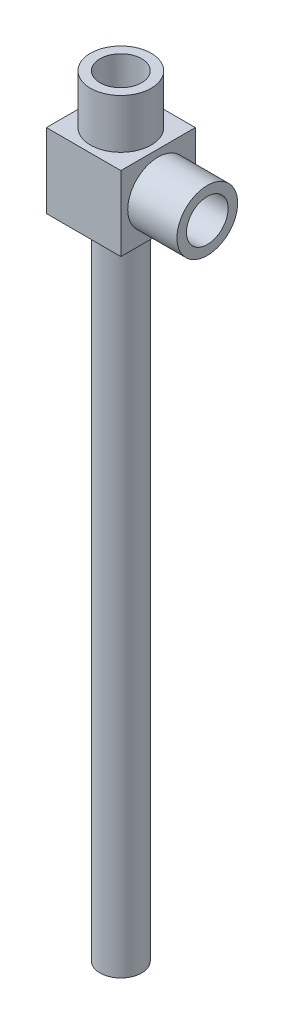
ISO-10303-21;
HEADER;
FILE_DESCRIPTION(('STEP AP214'),'2;1');
FILE_NAME('part.step','',(''),(''),'','','');
FILE_SCHEMA(('AUTOMOTIVE_DESIGN { 1 0 10303 214 1 1 1 1 }'));
ENDSEC;
DATA;
#1=APPLICATION_CONTEXT('core data for automotive mechanical design processes');
#2=APPLICATION_PROTOCOL_DEFINITION('international standard','automotive_design',2000,#1);
#3=PRODUCT_CONTEXT('',#1,'mechanical');
#4=PRODUCT('Part','Part','',(#3));
#5=PRODUCT_RELATED_PRODUCT_CATEGORY('part','',(#4));
#6=PRODUCT_DEFINITION_FORMATION('','',#4);
#7=PRODUCT_DEFINITION_CONTEXT('part definition',#1,'design');
#8=PRODUCT_DEFINITION('design','',#6,#7);
#9=PRODUCT_DEFINITION_SHAPE('','',#8);
#10=(LENGTH_UNIT() NAMED_UNIT(*) SI_UNIT(.MILLI.,.METRE.));
#11=(NAMED_UNIT(*) PLANE_ANGLE_UNIT() SI_UNIT($,.RADIAN.));
#12=(NAMED_UNIT(*) SI_UNIT($,.STERADIAN.) SOLID_ANGLE_UNIT());
#13=UNCERTAINTY_MEASURE_WITH_UNIT(LENGTH_MEASURE(1.E-05),#10,'distance_accuracy_value','');
#14=(GEOMETRIC_REPRESENTATION_CONTEXT(3) GLOBAL_UNCERTAINTY_ASSIGNED_CONTEXT((#13)) GLOBAL_UNIT_ASSIGNED_CONTEXT((#10,
#11,#12)) REPRESENTATION_CONTEXT('',''));
#15=CARTESIAN_POINT('',(0.,0.,0.));
#16=DIRECTION('',(0.,0.,1.));
#17=DIRECTION('',(1.,0.,0.));
#18=AXIS2_PLACEMENT_3D('',#15,#16,#17);
#19=CARTESIAN_POINT('',(0.,-407.25,37.25));
#20=DIRECTION('',(0.,1.,0.));
#21=DIRECTION('',(0.,0.,1.));
#22=AXIS2_PLACEMENT_3D('',#19,#20,#21);
#23=CYLINDRICAL_SURFACE('',#22,12.7);
#24=CARTESIAN_POINT('',(0.,-407.25,37.25));
#25=DIRECTION('',(0.,1.,0.));
#26=DIRECTION('',(0.,0.,1.));
#27=AXIS2_PLACEMENT_3D('',#24,#25,#26);
#28=CIRCLE('',#27,12.7);
#29=CARTESIAN_POINT('',(0.,-407.25,49.95));
#30=VERTEX_POINT('',#29);
#31=EDGE_CURVE('E126',#30,#30,#28,.T.);
#32=ORIENTED_EDGE('',*,*,#31,.T.);
#33=EDGE_LOOP('',(#32));
#34=FACE_BOUND('',#33,.T.);
#35=CARTESIAN_POINT('',(0.,-12.7,37.25));
#36=DIRECTION('',(0.,1.,0.));
#37=DIRECTION('',(0.,0.,1.));
#38=AXIS2_PLACEMENT_3D('',#35,#36,#37);
#39=CIRCLE('',#38,12.7);
#40=CARTESIAN_POINT('',(0.,-12.7,49.95));
#41=VERTEX_POINT('',#40);
#42=EDGE_CURVE('E125',#41,#41,#39,.T.);
#43=ORIENTED_EDGE('',*,*,#42,.F.);
#44=EDGE_LOOP('',(#43));
#45=FACE_BOUND('',#44,.T.);
#46=ADVANCED_FACE('F47',(#34,#45),#23,.T.);
#47=CARTESIAN_POINT('',(0.,-407.25,37.25));
#48=DIRECTION('',(0.,1.,0.));
#49=DIRECTION('',(0.,0.,1.));
#50=AXIS2_PLACEMENT_3D('',#47,#48,#49);
#51=PLANE('',#50);
#52=ORIENTED_EDGE('',*,*,#31,.F.);
#53=EDGE_LOOP('',(#52));
#54=FACE_BOUND('',#53,.T.);
#55=ADVANCED_FACE('F135',(#54),#51,.F.);
#56=CARTESIAN_POINT('',(-22.7,32.7,14.55));
#57=DIRECTION('',(1.,0.,0.));
#58=DIRECTION('',(0.,0.,-1.));
#59=AXIS2_PLACEMENT_3D('',#56,#57,#58);
#60=PLANE('',#59);
#61=DIRECTION('',(0.,0.,1.));
#62=VECTOR('',#61,1.);
#63=CARTESIAN_POINT('',(-22.7,-12.7,14.55));
#64=LINE('',#63,#62);
#65=CARTESIAN_POINT('',(-22.7,-12.7,14.55));
#66=VERTEX_POINT('',#65);
#67=CARTESIAN_POINT('',(-22.7,-12.7,59.95));
#68=VERTEX_POINT('',#67);
#69=EDGE_CURVE('E115',#66,#68,#64,.T.);
#70=ORIENTED_EDGE('',*,*,#69,.T.);
#71=DIRECTION('',(0.,-1.,0.));
#72=VECTOR('',#71,1.);
#73=CARTESIAN_POINT('',(-22.7,32.7,59.95));
#74=LINE('',#73,#72);
#75=CARTESIAN_POINT('',(-22.7,32.7,59.95));
#76=VERTEX_POINT('',#75);
#77=EDGE_CURVE('E106',#76,#68,#74,.T.);
#78=ORIENTED_EDGE('',*,*,#77,.F.);
#79=DIRECTION('',(0.,0.,1.));
#80=VECTOR('',#79,1.);
#81=CARTESIAN_POINT('',(-22.7,32.7,14.55));
#82=LINE('',#81,#80);
#83=CARTESIAN_POINT('',(-22.7,32.7,14.55));
#84=VERTEX_POINT('',#83);
#85=EDGE_CURVE('E100',#84,#76,#82,.T.);
#86=ORIENTED_EDGE('',*,*,#85,.F.);
#87=DIRECTION('',(0.,-1.,0.));
#88=VECTOR('',#87,1.);
#89=CARTESIAN_POINT('',(-22.7,32.7,14.55));
#90=LINE('',#89,#88);
#91=EDGE_CURVE('E111',#84,#66,#90,.T.);
#92=ORIENTED_EDGE('',*,*,#91,.T.);
#93=EDGE_LOOP('',(#70,#78,#86,#92));
#94=FACE_BOUND('',#93,.T.);
#95=ADVANCED_FACE('F140',(#94),#60,.F.);
#96=CARTESIAN_POINT('',(22.7,32.7,59.95));
#97=DIRECTION('',(0.,0.,-1.));
#98=DIRECTION('',(-1.,0.,0.));
#99=AXIS2_PLACEMENT_3D('',#96,#97,#98);
#100=PLANE('',#99);
#101=DIRECTION('',(1.,0.,0.));
#102=VECTOR('',#101,1.);
#103=CARTESIAN_POINT('',(22.7,-12.7,59.95));
#104=LINE('',#103,#102);
#105=CARTESIAN_POINT('',(22.7,-12.7,59.95));
#106=VERTEX_POINT('',#105);
#107=EDGE_CURVE('E105',#68,#106,#104,.T.);
#108=ORIENTED_EDGE('',*,*,#107,.T.);
#109=DIRECTION('',(0.,-1.,0.));
#110=VECTOR('',#109,1.);
#111=CARTESIAN_POINT('',(22.7,32.7,59.95));
#112=LINE('',#111,#110);
#113=CARTESIAN_POINT('',(22.7,32.7,59.95));
#114=VERTEX_POINT('',#113);
#115=EDGE_CURVE('E103',#114,#106,#112,.T.);
#116=ORIENTED_EDGE('',*,*,#115,.F.);
#117=DIRECTION('',(1.,0.,0.));
#118=VECTOR('',#117,1.);
#119=CARTESIAN_POINT('',(22.7,32.7,59.95));
#120=LINE('',#119,#118);
#121=EDGE_CURVE('E95',#76,#114,#120,.T.);
#122=ORIENTED_EDGE('',*,*,#121,.F.);
#123=ORIENTED_EDGE('',*,*,#77,.T.);
#124=EDGE_LOOP('',(#108,#116,#122,#123));
#125=FACE_BOUND('',#124,.T.);
#126=ADVANCED_FACE('F104',(#125),#100,.F.);
#127=CARTESIAN_POINT('',(22.7,32.7,14.55));
#128=DIRECTION('',(-1.,0.,0.));
#129=DIRECTION('',(0.,0.,1.));
#130=AXIS2_PLACEMENT_3D('',#127,#128,#129);
#131=PLANE('',#130);
#132=CARTESIAN_POINT('',(22.7,9.99999999999999,37.25));
#133=DIRECTION('',(-1.,0.,0.));
#134=DIRECTION('',(0.,0.,1.));
#135=AXIS2_PLACEMENT_3D('',#132,#133,#134);
#136=CIRCLE('',#135,18.5);
#137=CARTESIAN_POINT('',(22.7,9.99999999999999,55.75));
#138=VERTEX_POINT('',#137);
#139=EDGE_CURVE('E50',#138,#138,#136,.F.);
#140=ORIENTED_EDGE('',*,*,#139,.F.);
#141=EDGE_LOOP('',(#140));
#142=FACE_BOUND('',#141,.T.);
#143=DIRECTION('',(0.,0.,-1.));
#144=VECTOR('',#143,1.);
#145=CARTESIAN_POINT('',(22.7,-12.7,14.55));
#146=LINE('',#145,#144);
#147=CARTESIAN_POINT('',(22.7,-12.7,14.55));
#148=VERTEX_POINT('',#147);
#149=EDGE_CURVE('E81',#106,#148,#146,.T.);
#150=ORIENTED_EDGE('',*,*,#149,.T.);
#151=DIRECTION('',(0.,-1.,0.));
#152=VECTOR('',#151,1.);
#153=CARTESIAN_POINT('',(22.7,32.7,14.55));
#154=LINE('',#153,#152);
#155=CARTESIAN_POINT('',(22.7,32.7,14.55));
#156=VERTEX_POINT('',#155);
#157=EDGE_CURVE('E107',#156,#148,#154,.T.);
#158=ORIENTED_EDGE('',*,*,#157,.F.);
#159=DIRECTION('',(0.,0.,-1.));
#160=VECTOR('',#159,1.);
#161=CARTESIAN_POINT('',(22.7,32.7,14.55));
#162=LINE('',#161,#160);
#163=EDGE_CURVE('E98',#114,#156,#162,.T.);
#164=ORIENTED_EDGE('',*,*,#163,.F.);
#165=ORIENTED_EDGE('',*,*,#115,.T.);
#166=EDGE_LOOP('',(#150,#158,#164,#165));
#167=FACE_BOUND('',#166,.T.);
#168=ADVANCED_FACE('F109',(#142,#167),#131,.F.);
#169=CARTESIAN_POINT('',(22.7,32.7,14.55));
#170=DIRECTION('',(0.,0.,1.));
#171=DIRECTION('',(1.,0.,0.));
#172=AXIS2_PLACEMENT_3D('',#169,#170,#171);
#173=PLANE('',#172);
#174=DIRECTION('',(-1.,0.,0.));
#175=VECTOR('',#174,1.);
#176=CARTESIAN_POINT('',(22.7,-12.7,14.55));
#177=LINE('',#176,#175);
#178=EDGE_CURVE('E87',#148,#66,#177,.T.);
#179=ORIENTED_EDGE('',*,*,#178,.T.);
#180=ORIENTED_EDGE('',*,*,#91,.F.);
#181=DIRECTION('',(-1.,0.,0.));
#182=VECTOR('',#181,1.);
#183=CARTESIAN_POINT('',(22.7,32.7,14.55));
#184=LINE('',#183,#182);
#185=EDGE_CURVE('E64',#156,#84,#184,.T.);
#186=ORIENTED_EDGE('',*,*,#185,.F.);
#187=ORIENTED_EDGE('',*,*,#157,.T.);
#188=EDGE_LOOP('',(#179,#180,#186,#187));
#189=FACE_BOUND('',#188,.T.);
#190=ADVANCED_FACE('F153',(#189),#173,.F.);
#191=CARTESIAN_POINT('',(0.,32.7,0.));
#192=DIRECTION('',(0.,-1.,0.));
#193=DIRECTION('',(0.,0.,-1.));
#194=AXIS2_PLACEMENT_3D('',#191,#192,#193);
#195=PLANE('',#194);
#196=CARTESIAN_POINT('',(0.,32.7,37.25));
#197=DIRECTION('',(0.,-1.,0.));
#198=DIRECTION('',(0.,0.,-1.));
#199=AXIS2_PLACEMENT_3D('',#196,#197,#198);
#200=CIRCLE('',#199,18.5);
#201=CARTESIAN_POINT('',(0.,32.7,18.75));
#202=VERTEX_POINT('',#201);
#203=EDGE_CURVE('E13',#202,#202,#200,.F.);
#204=ORIENTED_EDGE('',*,*,#203,.F.);
#205=EDGE_LOOP('',(#204));
#206=FACE_BOUND('',#205,.T.);
#207=ORIENTED_EDGE('',*,*,#85,.T.);
#208=ORIENTED_EDGE('',*,*,#121,.T.);
#209=ORIENTED_EDGE('',*,*,#163,.T.);
#210=ORIENTED_EDGE('',*,*,#185,.T.);
#211=EDGE_LOOP('',(#207,#208,#209,#210));
#212=FACE_BOUND('',#211,.T.);
#213=ADVANCED_FACE('F96',(#206,#212),#195,.F.);
#214=CARTESIAN_POINT('',(0.,-12.7,0.));
#215=DIRECTION('',(0.,-1.,0.));
#216=DIRECTION('',(0.,0.,-1.));
#217=AXIS2_PLACEMENT_3D('',#214,#215,#216);
#218=PLANE('',#217);
#219=ORIENTED_EDGE('',*,*,#42,.T.);
#220=EDGE_LOOP('',(#219));
#221=FACE_BOUND('',#220,.T.);
#222=ORIENTED_EDGE('',*,*,#69,.F.);
#223=ORIENTED_EDGE('',*,*,#178,.F.);
#224=ORIENTED_EDGE('',*,*,#149,.F.);
#225=ORIENTED_EDGE('',*,*,#107,.F.);
#226=EDGE_LOOP('',(#222,#223,#224,#225));
#227=FACE_BOUND('',#226,.T.);
#228=ADVANCED_FACE('F131',(#221,#227),#218,.T.);
#229=CARTESIAN_POINT('',(52.7,9.99999999999999,37.25));
#230=DIRECTION('',(1.,0.,0.));
#231=DIRECTION('',(0.,0.,-1.));
#232=AXIS2_PLACEMENT_3D('',#229,#230,#231);
#233=PLANE('',#232);
#234=CARTESIAN_POINT('',(52.7,9.99999999999999,37.25));
#235=DIRECTION('',(1.,0.,0.));
#236=DIRECTION('',(0.,0.,-1.));
#237=AXIS2_PLACEMENT_3D('',#234,#235,#236);
#238=CIRCLE('',#237,18.5);
#239=CARTESIAN_POINT('',(52.7,9.99999999999999,18.75));
#240=VERTEX_POINT('',#239);
#241=EDGE_CURVE('E118',#240,#240,#238,.T.);
#242=ORIENTED_EDGE('',*,*,#241,.T.);
#243=EDGE_LOOP('',(#242));
#244=FACE_BOUND('',#243,.T.);
#245=CARTESIAN_POINT('',(52.7,9.99999999999999,37.25));
#246=DIRECTION('',(1.,0.,0.));
#247=DIRECTION('',(0.,0.,-1.));
#248=AXIS2_PLACEMENT_3D('',#245,#246,#247);
#249=CIRCLE('',#248,12.7);
#250=CARTESIAN_POINT('',(52.7,9.99999999999999,24.55));
#251=VERTEX_POINT('',#250);
#252=EDGE_CURVE('E201',#251,#251,#249,.T.);
#253=ORIENTED_EDGE('',*,*,#252,.F.);
#254=EDGE_LOOP('',(#253));
#255=FACE_BOUND('',#254,.T.);
#256=ADVANCED_FACE('F160',(#244,#255),#233,.T.);
#257=CARTESIAN_POINT('',(52.7,9.99999999999999,37.25));
#258=DIRECTION('',(-1.,0.,0.));
#259=DIRECTION('',(0.,0.,1.));
#260=AXIS2_PLACEMENT_3D('',#257,#258,#259);
#261=CYLINDRICAL_SURFACE('',#260,18.5);
#262=ORIENTED_EDGE('',*,*,#241,.F.);
#263=EDGE_LOOP('',(#262));
#264=FACE_BOUND('',#263,.T.);
#265=ORIENTED_EDGE('',*,*,#139,.T.);
#266=EDGE_LOOP('',(#265));
#267=FACE_BOUND('',#266,.T.);
#268=ADVANCED_FACE('F165',(#264,#267),#261,.T.);
#269=CARTESIAN_POINT('',(52.7,9.99999999999999,37.25));
#270=DIRECTION('',(-1.,0.,0.));
#271=DIRECTION('',(0.,0.,1.));
#272=AXIS2_PLACEMENT_3D('',#269,#270,#271);
#273=CYLINDRICAL_SURFACE('',#272,12.7);
#274=ORIENTED_EDGE('',*,*,#252,.T.);
#275=EDGE_LOOP('',(#274));
#276=FACE_BOUND('',#275,.T.);
#277=CARTESIAN_POINT('',(22.7,9.99999999999999,37.25));
#278=DIRECTION('',(1.,0.,0.));
#279=DIRECTION('',(0.,0.,-1.));
#280=AXIS2_PLACEMENT_3D('',#277,#278,#279);
#281=CIRCLE('',#280,12.7);
#282=CARTESIAN_POINT('',(22.7,9.99999999999999,24.55));
#283=VERTEX_POINT('',#282);
#284=EDGE_CURVE('E197',#283,#283,#281,.T.);
#285=ORIENTED_EDGE('',*,*,#284,.F.);
#286=EDGE_LOOP('',(#285));
#287=FACE_BOUND('',#286,.T.);
#288=ADVANCED_FACE('F168',(#276,#287),#273,.F.);
#289=ORIENTED_EDGE('',*,*,#284,.T.);
#290=EDGE_LOOP('',(#289));
#291=FACE_BOUND('',#290,.T.);
#292=ADVANCED_FACE('F155',(#291),#131,.F.);
#293=CARTESIAN_POINT('',(0.,62.7,37.25));
#294=DIRECTION('',(0.,-1.,0.));
#295=DIRECTION('',(0.,0.,-1.));
#296=AXIS2_PLACEMENT_3D('',#293,#294,#295);
#297=CYLINDRICAL_SURFACE('',#296,18.5);
#298=CARTESIAN_POINT('',(0.,62.7,37.25));
#299=DIRECTION('',(0.,1.,0.));
#300=DIRECTION('',(0.,0.,1.));
#301=AXIS2_PLACEMENT_3D('',#298,#299,#300);
#302=CIRCLE('',#301,18.5);
#303=CARTESIAN_POINT('',(0.,62.7,55.75));
#304=VERTEX_POINT('',#303);
#305=EDGE_CURVE('E198',#304,#304,#302,.T.);
#306=ORIENTED_EDGE('',*,*,#305,.F.);
#307=EDGE_LOOP('',(#306));
#308=FACE_BOUND('',#307,.T.);
#309=ORIENTED_EDGE('',*,*,#203,.T.);
#310=EDGE_LOOP('',(#309));
#311=FACE_BOUND('',#310,.T.);
#312=ADVANCED_FACE('F176',(#308,#311),#297,.T.);
#313=CARTESIAN_POINT('',(0.,62.7,37.25));
#314=DIRECTION('',(0.,-1.,0.));
#315=DIRECTION('',(0.,0.,-1.));
#316=AXIS2_PLACEMENT_3D('',#313,#314,#315);
#317=CYLINDRICAL_SURFACE('',#316,12.7);
#318=CARTESIAN_POINT('',(0.,62.7,37.25));
#319=DIRECTION('',(0.,1.,0.));
#320=DIRECTION('',(0.,0.,1.));
#321=AXIS2_PLACEMENT_3D('',#318,#319,#320);
#322=CIRCLE('',#321,12.7);
#323=CARTESIAN_POINT('',(0.,62.7,49.95));
#324=VERTEX_POINT('',#323);
#325=EDGE_CURVE('E192',#324,#324,#322,.T.);
#326=ORIENTED_EDGE('',*,*,#325,.T.);
#327=EDGE_LOOP('',(#326));
#328=FACE_BOUND('',#327,.T.);
#329=CARTESIAN_POINT('',(0.,32.7,37.25));
#330=DIRECTION('',(0.,-1.,0.));
#331=DIRECTION('',(0.,0.,-1.));
#332=AXIS2_PLACEMENT_3D('',#329,#330,#331);
#333=CIRCLE('',#332,12.7);
#334=CARTESIAN_POINT('',(0.,32.7,24.55));
#335=VERTEX_POINT('',#334);
#336=EDGE_CURVE('E195',#335,#335,#333,.F.);
#337=ORIENTED_EDGE('',*,*,#336,.F.);
#338=EDGE_LOOP('',(#337));
#339=FACE_BOUND('',#338,.T.);
#340=ADVANCED_FACE('F179',(#328,#339),#317,.F.);
#341=CARTESIAN_POINT('',(0.,62.7,37.25));
#342=DIRECTION('',(0.,1.,0.));
#343=DIRECTION('',(0.,0.,1.));
#344=AXIS2_PLACEMENT_3D('',#341,#342,#343);
#345=PLANE('',#344);
#346=ORIENTED_EDGE('',*,*,#305,.T.);
#347=EDGE_LOOP('',(#346));
#348=FACE_BOUND('',#347,.T.);
#349=ORIENTED_EDGE('',*,*,#325,.F.);
#350=EDGE_LOOP('',(#349));
#351=FACE_BOUND('',#350,.T.);
#352=ADVANCED_FACE('F181',(#348,#351),#345,.T.);
#353=ORIENTED_EDGE('',*,*,#336,.T.);
#354=EDGE_LOOP('',(#353));
#355=FACE_BOUND('',#354,.T.);
#356=ADVANCED_FACE('F164',(#355),#195,.F.);
#357=CLOSED_SHELL('',(#46,#55,#95,#126,#168,#190,#213,#228,#256,#268,#288,#292,#312,#340,#352,#356));
#358=MANIFOLD_SOLID_BREP('B2',#357);
#359=ADVANCED_BREP_SHAPE_REPRESENTATION('',(#18,#358),#14);
#360=SHAPE_DEFINITION_REPRESENTATION(#9,#359);
ENDSEC;
END-ISO-10303-21;
